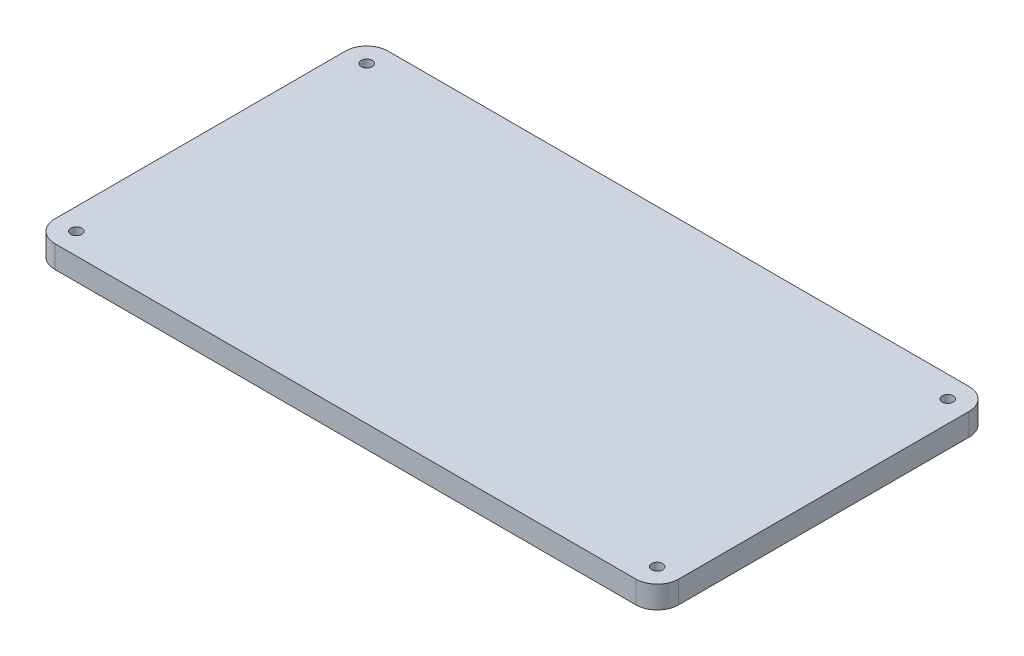
ISO-10303-21;
HEADER;
FILE_DESCRIPTION(('STEP AP214'),'2;1');
FILE_NAME('part.step','',(''),(''),'','','');
FILE_SCHEMA(('AUTOMOTIVE_DESIGN { 1 0 10303 214 1 1 1 1 }'));
ENDSEC;
DATA;
#1=APPLICATION_CONTEXT('core data for automotive mechanical design processes');
#2=APPLICATION_PROTOCOL_DEFINITION('international standard','automotive_design',2000,#1);
#3=PRODUCT_CONTEXT('',#1,'mechanical');
#4=PRODUCT('Part','Part','',(#3));
#5=PRODUCT_RELATED_PRODUCT_CATEGORY('part','',(#4));
#6=PRODUCT_DEFINITION_FORMATION('','',#4);
#7=PRODUCT_DEFINITION_CONTEXT('part definition',#1,'design');
#8=PRODUCT_DEFINITION('design','',#6,#7);
#9=PRODUCT_DEFINITION_SHAPE('','',#8);
#10=(LENGTH_UNIT() NAMED_UNIT(*) SI_UNIT(.MILLI.,.METRE.));
#11=(NAMED_UNIT(*) PLANE_ANGLE_UNIT() SI_UNIT($,.RADIAN.));
#12=(NAMED_UNIT(*) SI_UNIT($,.STERADIAN.) SOLID_ANGLE_UNIT());
#13=UNCERTAINTY_MEASURE_WITH_UNIT(LENGTH_MEASURE(1.E-05),#10,'distance_accuracy_value','');
#14=(GEOMETRIC_REPRESENTATION_CONTEXT(3) GLOBAL_UNCERTAINTY_ASSIGNED_CONTEXT((#13)) GLOBAL_UNIT_ASSIGNED_CONTEXT((#10,
#11,#12)) REPRESENTATION_CONTEXT('',''));
#15=CARTESIAN_POINT('',(0.,0.,0.));
#16=DIRECTION('',(0.,0.,1.));
#17=DIRECTION('',(1.,0.,0.));
#18=AXIS2_PLACEMENT_3D('',#15,#16,#17);
#19=CARTESIAN_POINT('',(65.,5.,-27.5));
#20=DIRECTION('',(0.,1.,0.));
#21=DIRECTION('',(0.,0.,1.));
#22=AXIS2_PLACEMENT_3D('',#19,#20,#21);
#23=PLANE('',#22);
#24=CARTESIAN_POINT('',(-65.,5.,37.5));
#25=DIRECTION('',(0.,1.,0.));
#26=DIRECTION('',(0.,0.,1.));
#27=AXIS2_PLACEMENT_3D('',#24,#25,#26);
#28=CIRCLE('',#27,1.225);
#29=CARTESIAN_POINT('',(-65.,5.,38.725));
#30=VERTEX_POINT('',#29);
#31=EDGE_CURVE('E221',#30,#30,#28,.T.);
#32=ORIENTED_EDGE('',*,*,#31,.F.);
#33=EDGE_LOOP('',(#32));
#34=FACE_BOUND('',#33,.T.);
#35=CARTESIAN_POINT('',(65.,5.,-27.5));
#36=DIRECTION('',(0.,1.,0.));
#37=DIRECTION('',(0.,0.,1.));
#38=AXIS2_PLACEMENT_3D('',#35,#36,#37);
#39=CIRCLE('',#38,1.225);
#40=CARTESIAN_POINT('',(65.,5.,-26.275));
#41=VERTEX_POINT('',#40);
#42=EDGE_CURVE('E146',#41,#41,#39,.T.);
#43=ORIENTED_EDGE('',*,*,#42,.F.);
#44=EDGE_LOOP('',(#43));
#45=FACE_BOUND('',#44,.T.);
#46=CARTESIAN_POINT('',(65.,5.,-27.5));
#47=DIRECTION('',(0.,1.,0.));
#48=DIRECTION('',(0.,0.,1.));
#49=AXIS2_PLACEMENT_3D('',#46,#47,#48);
#50=CIRCLE('',#49,4.8);
#51=CARTESIAN_POINT('',(69.8,5.,-27.5));
#52=VERTEX_POINT('',#51);
#53=CARTESIAN_POINT('',(65.,5.,-32.3));
#54=VERTEX_POINT('',#53);
#55=EDGE_CURVE('E164',#52,#54,#50,.T.);
#56=ORIENTED_EDGE('',*,*,#55,.T.);
#57=DIRECTION('',(-1.,0.,0.));
#58=VECTOR('',#57,1.);
#59=CARTESIAN_POINT('',(-65.,5.,-32.3));
#60=LINE('',#59,#58);
#61=CARTESIAN_POINT('',(-65.,5.,-32.3));
#62=VERTEX_POINT('',#61);
#63=EDGE_CURVE('E100',#54,#62,#60,.T.);
#64=ORIENTED_EDGE('',*,*,#63,.T.);
#65=CARTESIAN_POINT('',(-65.,5.,-27.5));
#66=DIRECTION('',(0.,1.,0.));
#67=DIRECTION('',(0.,0.,1.));
#68=AXIS2_PLACEMENT_3D('',#65,#66,#67);
#69=CIRCLE('',#68,4.8);
#70=CARTESIAN_POINT('',(-69.8,5.,-27.5));
#71=VERTEX_POINT('',#70);
#72=EDGE_CURVE('E185',#62,#71,#69,.T.);
#73=ORIENTED_EDGE('',*,*,#72,.T.);
#74=DIRECTION('',(0.,0.,1.));
#75=VECTOR('',#74,1.);
#76=CARTESIAN_POINT('',(-69.8,5.,-27.5));
#77=LINE('',#76,#75);
#78=CARTESIAN_POINT('',(-69.8,5.,37.5));
#79=VERTEX_POINT('',#78);
#80=EDGE_CURVE('E199',#71,#79,#77,.T.);
#81=ORIENTED_EDGE('',*,*,#80,.T.);
#82=CARTESIAN_POINT('',(-65.,5.,37.5));
#83=DIRECTION('',(0.,1.,0.));
#84=DIRECTION('',(0.,0.,-1.));
#85=AXIS2_PLACEMENT_3D('',#82,#83,#84);
#86=CIRCLE('',#85,4.8);
#87=CARTESIAN_POINT('',(-65.,5.,42.3));
#88=VERTEX_POINT('',#87);
#89=EDGE_CURVE('E119',#79,#88,#86,.T.);
#90=ORIENTED_EDGE('',*,*,#89,.T.);
#91=DIRECTION('',(1.,0.,0.));
#92=VECTOR('',#91,1.);
#93=CARTESIAN_POINT('',(-65.,5.,42.3));
#94=LINE('',#93,#92);
#95=CARTESIAN_POINT('',(65.,5.,42.3));
#96=VERTEX_POINT('',#95);
#97=EDGE_CURVE('E113',#88,#96,#94,.T.);
#98=ORIENTED_EDGE('',*,*,#97,.T.);
#99=CARTESIAN_POINT('',(65.,5.,37.5));
#100=DIRECTION('',(0.,1.,0.));
#101=DIRECTION('',(0.,0.,1.));
#102=AXIS2_PLACEMENT_3D('',#99,#100,#101);
#103=CIRCLE('',#102,4.8);
#104=CARTESIAN_POINT('',(69.8,5.,37.5));
#105=VERTEX_POINT('',#104);
#106=EDGE_CURVE('E117',#96,#105,#103,.T.);
#107=ORIENTED_EDGE('',*,*,#106,.T.);
#108=DIRECTION('',(0.,0.,-1.));
#109=VECTOR('',#108,1.);
#110=CARTESIAN_POINT('',(69.8,5.,-27.5));
#111=LINE('',#110,#109);
#112=EDGE_CURVE('E57',#105,#52,#111,.T.);
#113=ORIENTED_EDGE('',*,*,#112,.T.);
#114=EDGE_LOOP('',(#56,#64,#73,#81,#90,#98,#107,#113));
#115=FACE_BOUND('',#114,.T.);
#116=CARTESIAN_POINT('',(65.,5.,37.5));
#117=DIRECTION('',(0.,1.,0.));
#118=DIRECTION('',(0.,0.,1.));
#119=AXIS2_PLACEMENT_3D('',#116,#117,#118);
#120=CIRCLE('',#119,1.225);
#121=CARTESIAN_POINT('',(65.,5.,38.725));
#122=VERTEX_POINT('',#121);
#123=EDGE_CURVE('E213',#122,#122,#120,.T.);
#124=ORIENTED_EDGE('',*,*,#123,.F.);
#125=EDGE_LOOP('',(#124));
#126=FACE_BOUND('',#125,.T.);
#127=CARTESIAN_POINT('',(-65.,5.,-27.5));
#128=DIRECTION('',(0.,1.,0.));
#129=DIRECTION('',(0.,0.,1.));
#130=AXIS2_PLACEMENT_3D('',#127,#128,#129);
#131=CIRCLE('',#130,1.225);
#132=CARTESIAN_POINT('',(-65.,5.,-26.275));
#133=VERTEX_POINT('',#132);
#134=EDGE_CURVE('E229',#133,#133,#131,.T.);
#135=ORIENTED_EDGE('',*,*,#134,.F.);
#136=EDGE_LOOP('',(#135));
#137=FACE_BOUND('',#136,.T.);
#138=ADVANCED_FACE('F39',(#34,#45,#115,#126,#137),#23,.T.);
#139=CARTESIAN_POINT('',(65.,0.,-27.5));
#140=DIRECTION('',(0.,1.,0.));
#141=DIRECTION('',(0.,0.,1.));
#142=AXIS2_PLACEMENT_3D('',#139,#140,#141);
#143=PLANE('',#142);
#144=CARTESIAN_POINT('',(65.,0.,-27.5));
#145=DIRECTION('',(0.,1.,0.));
#146=DIRECTION('',(0.,0.,1.));
#147=AXIS2_PLACEMENT_3D('',#144,#145,#146);
#148=CIRCLE('',#147,4.8);
#149=CARTESIAN_POINT('',(69.8,0.,-27.5));
#150=VERTEX_POINT('',#149);
#151=CARTESIAN_POINT('',(65.,0.,-32.3));
#152=VERTEX_POINT('',#151);
#153=EDGE_CURVE('E141',#150,#152,#148,.T.);
#154=ORIENTED_EDGE('',*,*,#153,.F.);
#155=DIRECTION('',(0.,0.,-1.));
#156=VECTOR('',#155,1.);
#157=CARTESIAN_POINT('',(69.8,0.,-27.5));
#158=LINE('',#157,#156);
#159=CARTESIAN_POINT('',(69.8,0.,37.5));
#160=VERTEX_POINT('',#159);
#161=EDGE_CURVE('E92',#160,#150,#158,.T.);
#162=ORIENTED_EDGE('',*,*,#161,.F.);
#163=CARTESIAN_POINT('',(65.,0.,37.5));
#164=DIRECTION('',(0.,1.,0.));
#165=DIRECTION('',(0.,0.,1.));
#166=AXIS2_PLACEMENT_3D('',#163,#164,#165);
#167=CIRCLE('',#166,4.8);
#168=CARTESIAN_POINT('',(65.,0.,42.3));
#169=VERTEX_POINT('',#168);
#170=EDGE_CURVE('E86',#169,#160,#167,.T.);
#171=ORIENTED_EDGE('',*,*,#170,.F.);
#172=DIRECTION('',(1.,0.,0.));
#173=VECTOR('',#172,1.);
#174=CARTESIAN_POINT('',(-65.,0.,42.3));
#175=LINE('',#174,#173);
#176=CARTESIAN_POINT('',(-65.,0.,42.3));
#177=VERTEX_POINT('',#176);
#178=EDGE_CURVE('E128',#177,#169,#175,.T.);
#179=ORIENTED_EDGE('',*,*,#178,.F.);
#180=CARTESIAN_POINT('',(-65.,0.,37.5));
#181=DIRECTION('',(0.,1.,0.));
#182=DIRECTION('',(0.,0.,-1.));
#183=AXIS2_PLACEMENT_3D('',#180,#181,#182);
#184=CIRCLE('',#183,4.8);
#185=CARTESIAN_POINT('',(-69.8,0.,37.5));
#186=VERTEX_POINT('',#185);
#187=EDGE_CURVE('E155',#186,#177,#184,.T.);
#188=ORIENTED_EDGE('',*,*,#187,.F.);
#189=DIRECTION('',(0.,0.,1.));
#190=VECTOR('',#189,1.);
#191=CARTESIAN_POINT('',(-69.8,0.,-27.5));
#192=LINE('',#191,#190);
#193=CARTESIAN_POINT('',(-69.8,0.,-27.5));
#194=VERTEX_POINT('',#193);
#195=EDGE_CURVE('E152',#194,#186,#192,.T.);
#196=ORIENTED_EDGE('',*,*,#195,.F.);
#197=CARTESIAN_POINT('',(-65.,0.,-27.5));
#198=DIRECTION('',(0.,1.,0.));
#199=DIRECTION('',(0.,0.,1.));
#200=AXIS2_PLACEMENT_3D('',#197,#198,#199);
#201=CIRCLE('',#200,4.8);
#202=CARTESIAN_POINT('',(-65.,0.,-32.3));
#203=VERTEX_POINT('',#202);
#204=EDGE_CURVE('E149',#203,#194,#201,.T.);
#205=ORIENTED_EDGE('',*,*,#204,.F.);
#206=DIRECTION('',(-1.,0.,0.));
#207=VECTOR('',#206,1.);
#208=CARTESIAN_POINT('',(-65.,0.,-32.3));
#209=LINE('',#208,#207);
#210=EDGE_CURVE('E145',#152,#203,#209,.T.);
#211=ORIENTED_EDGE('',*,*,#210,.F.);
#212=EDGE_LOOP('',(#154,#162,#171,#179,#188,#196,#205,#211));
#213=FACE_BOUND('',#212,.T.);
#214=CARTESIAN_POINT('',(65.,0.,-27.5));
#215=DIRECTION('',(0.,1.,0.));
#216=DIRECTION('',(0.,0.,1.));
#217=AXIS2_PLACEMENT_3D('',#214,#215,#216);
#218=CIRCLE('',#217,1.225);
#219=CARTESIAN_POINT('',(65.,0.,-26.275));
#220=VERTEX_POINT('',#219);
#221=EDGE_CURVE('E209',#220,#220,#218,.T.);
#222=ORIENTED_EDGE('',*,*,#221,.T.);
#223=EDGE_LOOP('',(#222));
#224=FACE_BOUND('',#223,.T.);
#225=CARTESIAN_POINT('',(65.,0.,37.5));
#226=DIRECTION('',(0.,1.,0.));
#227=DIRECTION('',(0.,0.,1.));
#228=AXIS2_PLACEMENT_3D('',#225,#226,#227);
#229=CIRCLE('',#228,1.225);
#230=CARTESIAN_POINT('',(65.,0.,38.725));
#231=VERTEX_POINT('',#230);
#232=EDGE_CURVE('E217',#231,#231,#229,.T.);
#233=ORIENTED_EDGE('',*,*,#232,.T.);
#234=EDGE_LOOP('',(#233));
#235=FACE_BOUND('',#234,.T.);
#236=CARTESIAN_POINT('',(-65.,0.,37.5));
#237=DIRECTION('',(0.,1.,0.));
#238=DIRECTION('',(0.,0.,1.));
#239=AXIS2_PLACEMENT_3D('',#236,#237,#238);
#240=CIRCLE('',#239,1.225);
#241=CARTESIAN_POINT('',(-65.,0.,38.725));
#242=VERTEX_POINT('',#241);
#243=EDGE_CURVE('E225',#242,#242,#240,.T.);
#244=ORIENTED_EDGE('',*,*,#243,.T.);
#245=EDGE_LOOP('',(#244));
#246=FACE_BOUND('',#245,.T.);
#247=CARTESIAN_POINT('',(-65.,0.,-27.5));
#248=DIRECTION('',(0.,1.,0.));
#249=DIRECTION('',(0.,0.,1.));
#250=AXIS2_PLACEMENT_3D('',#247,#248,#249);
#251=CIRCLE('',#250,1.225);
#252=CARTESIAN_POINT('',(-65.,0.,-26.275));
#253=VERTEX_POINT('',#252);
#254=EDGE_CURVE('E233',#253,#253,#251,.T.);
#255=ORIENTED_EDGE('',*,*,#254,.T.);
#256=EDGE_LOOP('',(#255));
#257=FACE_BOUND('',#256,.T.);
#258=ADVANCED_FACE('F189',(#213,#224,#235,#246,#257),#143,.F.);
#259=CARTESIAN_POINT('',(65.,5.,-27.5));
#260=DIRECTION('',(0.,-1.,0.));
#261=DIRECTION('',(0.,0.,-1.));
#262=AXIS2_PLACEMENT_3D('',#259,#260,#261);
#263=CYLINDRICAL_SURFACE('',#262,4.8);
#264=ORIENTED_EDGE('',*,*,#153,.T.);
#265=DIRECTION('',(0.,-1.,0.));
#266=VECTOR('',#265,1.);
#267=CARTESIAN_POINT('',(65.,5.,-32.3));
#268=LINE('',#267,#266);
#269=EDGE_CURVE('E11',#54,#152,#268,.T.);
#270=ORIENTED_EDGE('',*,*,#269,.F.);
#271=ORIENTED_EDGE('',*,*,#55,.F.);
#272=DIRECTION('',(0.,-1.,0.));
#273=VECTOR('',#272,1.);
#274=CARTESIAN_POINT('',(69.8,5.,-27.5));
#275=LINE('',#274,#273);
#276=EDGE_CURVE('E137',#52,#150,#275,.T.);
#277=ORIENTED_EDGE('',*,*,#276,.T.);
#278=EDGE_LOOP('',(#264,#270,#271,#277));
#279=FACE_BOUND('',#278,.T.);
#280=ADVANCED_FACE('F41',(#279),#263,.T.);
#281=CARTESIAN_POINT('',(-65.,5.,-32.3));
#282=DIRECTION('',(0.,0.,1.));
#283=DIRECTION('',(1.,0.,0.));
#284=AXIS2_PLACEMENT_3D('',#281,#282,#283);
#285=PLANE('',#284);
#286=ORIENTED_EDGE('',*,*,#210,.T.);
#287=DIRECTION('',(0.,-1.,0.));
#288=VECTOR('',#287,1.);
#289=CARTESIAN_POINT('',(-65.,5.,-32.3));
#290=LINE('',#289,#288);
#291=EDGE_CURVE('E49',#62,#203,#290,.T.);
#292=ORIENTED_EDGE('',*,*,#291,.F.);
#293=ORIENTED_EDGE('',*,*,#63,.F.);
#294=ORIENTED_EDGE('',*,*,#269,.T.);
#295=EDGE_LOOP('',(#286,#292,#293,#294));
#296=FACE_BOUND('',#295,.T.);
#297=ADVANCED_FACE('F269',(#296),#285,.F.);
#298=CARTESIAN_POINT('',(-65.,5.,-27.5));
#299=DIRECTION('',(0.,-1.,0.));
#300=DIRECTION('',(0.,0.,-1.));
#301=AXIS2_PLACEMENT_3D('',#298,#299,#300);
#302=CYLINDRICAL_SURFACE('',#301,4.8);
#303=ORIENTED_EDGE('',*,*,#204,.T.);
#304=DIRECTION('',(0.,-1.,0.));
#305=VECTOR('',#304,1.);
#306=CARTESIAN_POINT('',(-69.8,5.,-27.5));
#307=LINE('',#306,#305);
#308=EDGE_CURVE('E175',#71,#194,#307,.T.);
#309=ORIENTED_EDGE('',*,*,#308,.F.);
#310=ORIENTED_EDGE('',*,*,#72,.F.);
#311=ORIENTED_EDGE('',*,*,#291,.T.);
#312=EDGE_LOOP('',(#303,#309,#310,#311));
#313=FACE_BOUND('',#312,.T.);
#314=ADVANCED_FACE('F183',(#313),#302,.T.);
#315=CARTESIAN_POINT('',(-69.8,5.,-27.5));
#316=DIRECTION('',(1.,0.,0.));
#317=DIRECTION('',(0.,0.,-1.));
#318=AXIS2_PLACEMENT_3D('',#315,#316,#317);
#319=PLANE('',#318);
#320=ORIENTED_EDGE('',*,*,#195,.T.);
#321=DIRECTION('',(0.,-1.,0.));
#322=VECTOR('',#321,1.);
#323=CARTESIAN_POINT('',(-69.8,5.,37.5));
#324=LINE('',#323,#322);
#325=EDGE_CURVE('E171',#79,#186,#324,.T.);
#326=ORIENTED_EDGE('',*,*,#325,.F.);
#327=ORIENTED_EDGE('',*,*,#80,.F.);
#328=ORIENTED_EDGE('',*,*,#308,.T.);
#329=EDGE_LOOP('',(#320,#326,#327,#328));
#330=FACE_BOUND('',#329,.T.);
#331=ADVANCED_FACE('F194',(#330),#319,.F.);
#332=CARTESIAN_POINT('',(-65.,5.,37.5));
#333=DIRECTION('',(0.,-1.,0.));
#334=DIRECTION('',(0.,0.,-1.));
#335=AXIS2_PLACEMENT_3D('',#332,#333,#334);
#336=CYLINDRICAL_SURFACE('',#335,4.8);
#337=ORIENTED_EDGE('',*,*,#187,.T.);
#338=DIRECTION('',(0.,-1.,0.));
#339=VECTOR('',#338,1.);
#340=CARTESIAN_POINT('',(-65.,5.,42.3));
#341=LINE('',#340,#339);
#342=EDGE_CURVE('E130',#88,#177,#341,.T.);
#343=ORIENTED_EDGE('',*,*,#342,.F.);
#344=ORIENTED_EDGE('',*,*,#89,.F.);
#345=ORIENTED_EDGE('',*,*,#325,.T.);
#346=EDGE_LOOP('',(#337,#343,#344,#345));
#347=FACE_BOUND('',#346,.T.);
#348=ADVANCED_FACE('F197',(#347),#336,.T.);
#349=CARTESIAN_POINT('',(-65.,5.,42.3));
#350=DIRECTION('',(0.,0.,-1.));
#351=DIRECTION('',(-1.,0.,0.));
#352=AXIS2_PLACEMENT_3D('',#349,#350,#351);
#353=PLANE('',#352);
#354=ORIENTED_EDGE('',*,*,#178,.T.);
#355=DIRECTION('',(0.,-1.,0.));
#356=VECTOR('',#355,1.);
#357=CARTESIAN_POINT('',(65.,5.,42.3));
#358=LINE('',#357,#356);
#359=EDGE_CURVE('E125',#96,#169,#358,.T.);
#360=ORIENTED_EDGE('',*,*,#359,.F.);
#361=ORIENTED_EDGE('',*,*,#97,.F.);
#362=ORIENTED_EDGE('',*,*,#342,.T.);
#363=EDGE_LOOP('',(#354,#360,#361,#362));
#364=FACE_BOUND('',#363,.T.);
#365=ADVANCED_FACE('F126',(#364),#353,.F.);
#366=CARTESIAN_POINT('',(65.,5.,37.5));
#367=DIRECTION('',(0.,-1.,0.));
#368=DIRECTION('',(0.,0.,-1.));
#369=AXIS2_PLACEMENT_3D('',#366,#367,#368);
#370=CYLINDRICAL_SURFACE('',#369,4.8);
#371=ORIENTED_EDGE('',*,*,#170,.T.);
#372=DIRECTION('',(0.,-1.,0.));
#373=VECTOR('',#372,1.);
#374=CARTESIAN_POINT('',(69.8,5.,37.5));
#375=LINE('',#374,#373);
#376=EDGE_CURVE('E131',#105,#160,#375,.T.);
#377=ORIENTED_EDGE('',*,*,#376,.F.);
#378=ORIENTED_EDGE('',*,*,#106,.F.);
#379=ORIENTED_EDGE('',*,*,#359,.T.);
#380=EDGE_LOOP('',(#371,#377,#378,#379));
#381=FACE_BOUND('',#380,.T.);
#382=ADVANCED_FACE('F133',(#381),#370,.T.);
#383=CARTESIAN_POINT('',(69.8,5.,-27.5));
#384=DIRECTION('',(-1.,0.,0.));
#385=DIRECTION('',(0.,0.,1.));
#386=AXIS2_PLACEMENT_3D('',#383,#384,#385);
#387=PLANE('',#386);
#388=ORIENTED_EDGE('',*,*,#161,.T.);
#389=ORIENTED_EDGE('',*,*,#276,.F.);
#390=ORIENTED_EDGE('',*,*,#112,.F.);
#391=ORIENTED_EDGE('',*,*,#376,.T.);
#392=EDGE_LOOP('',(#388,#389,#390,#391));
#393=FACE_BOUND('',#392,.T.);
#394=ADVANCED_FACE('F257',(#393),#387,.F.);
#395=CARTESIAN_POINT('',(65.,5.,-27.5));
#396=DIRECTION('',(0.,-1.,0.));
#397=DIRECTION('',(0.,0.,-1.));
#398=AXIS2_PLACEMENT_3D('',#395,#396,#397);
#399=CYLINDRICAL_SURFACE('',#398,1.225);
#400=ORIENTED_EDGE('',*,*,#42,.T.);
#401=EDGE_LOOP('',(#400));
#402=FACE_BOUND('',#401,.T.);
#403=ORIENTED_EDGE('',*,*,#221,.F.);
#404=EDGE_LOOP('',(#403));
#405=FACE_BOUND('',#404,.T.);
#406=ADVANCED_FACE('F254',(#402,#405),#399,.F.);
#407=CARTESIAN_POINT('',(65.,5.,37.5));
#408=DIRECTION('',(0.,-1.,0.));
#409=DIRECTION('',(0.,0.,-1.));
#410=AXIS2_PLACEMENT_3D('',#407,#408,#409);
#411=CYLINDRICAL_SURFACE('',#410,1.225);
#412=ORIENTED_EDGE('',*,*,#123,.T.);
#413=EDGE_LOOP('',(#412));
#414=FACE_BOUND('',#413,.T.);
#415=ORIENTED_EDGE('',*,*,#232,.F.);
#416=EDGE_LOOP('',(#415));
#417=FACE_BOUND('',#416,.T.);
#418=ADVANCED_FACE('F333',(#414,#417),#411,.F.);
#419=CARTESIAN_POINT('',(-65.,5.,37.5));
#420=DIRECTION('',(0.,-1.,0.));
#421=DIRECTION('',(0.,0.,-1.));
#422=AXIS2_PLACEMENT_3D('',#419,#420,#421);
#423=CYLINDRICAL_SURFACE('',#422,1.225);
#424=ORIENTED_EDGE('',*,*,#31,.T.);
#425=EDGE_LOOP('',(#424));
#426=FACE_BOUND('',#425,.T.);
#427=ORIENTED_EDGE('',*,*,#243,.F.);
#428=EDGE_LOOP('',(#427));
#429=FACE_BOUND('',#428,.T.);
#430=ADVANCED_FACE('F341',(#426,#429),#423,.F.);
#431=CARTESIAN_POINT('',(-65.,5.,-27.5));
#432=DIRECTION('',(0.,-1.,0.));
#433=DIRECTION('',(0.,0.,-1.));
#434=AXIS2_PLACEMENT_3D('',#431,#432,#433);
#435=CYLINDRICAL_SURFACE('',#434,1.225);
#436=ORIENTED_EDGE('',*,*,#134,.T.);
#437=EDGE_LOOP('',(#436));
#438=FACE_BOUND('',#437,.T.);
#439=ORIENTED_EDGE('',*,*,#254,.F.);
#440=EDGE_LOOP('',(#439));
#441=FACE_BOUND('',#440,.T.);
#442=ADVANCED_FACE('F241',(#438,#441),#435,.F.);
#443=CLOSED_SHELL('',(#138,#258,#280,#297,#314,#331,#348,#365,#382,#394,#406,#418,#430,#442));
#444=MANIFOLD_SOLID_BREP('B2',#443);
#445=ADVANCED_BREP_SHAPE_REPRESENTATION('',(#18,#444),#14);
#446=SHAPE_DEFINITION_REPRESENTATION(#9,#445);
ENDSEC;
END-ISO-10303-21;
